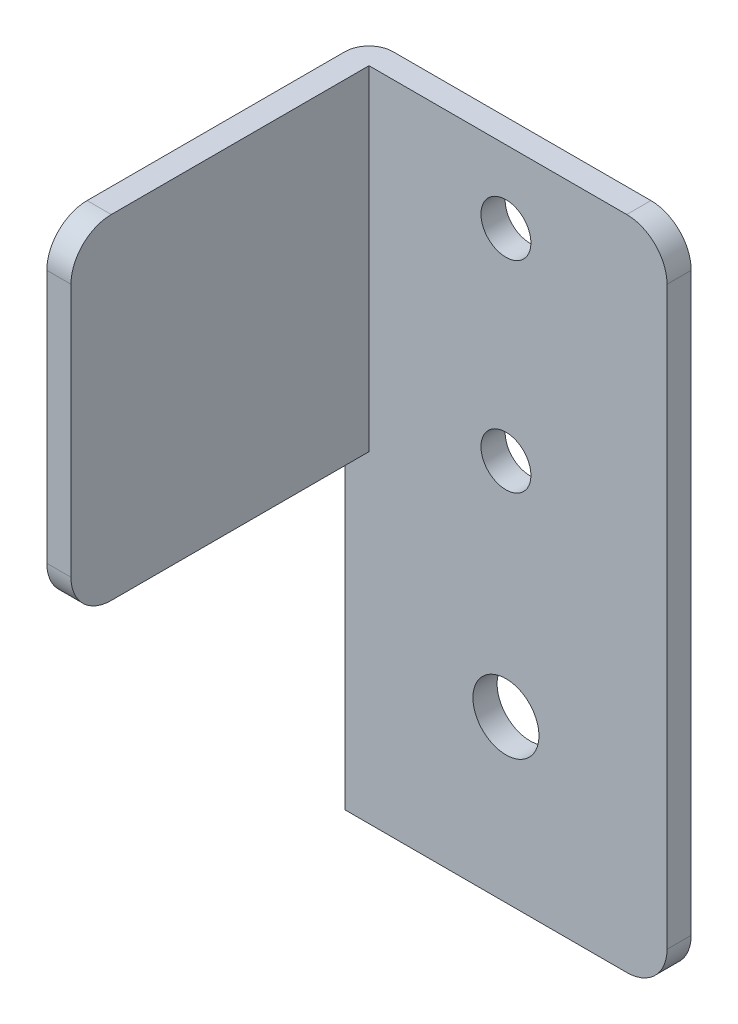
ISO-10303-21;
HEADER;
FILE_DESCRIPTION(('STEP AP214'),'2;1');
FILE_NAME('part.step','',(''),(''),'','','');
FILE_SCHEMA(('AUTOMOTIVE_DESIGN { 1 0 10303 214 1 1 1 1 }'));
ENDSEC;
DATA;
#1=APPLICATION_CONTEXT('core data for automotive mechanical design processes');
#2=APPLICATION_PROTOCOL_DEFINITION('international standard','automotive_design',2000,#1);
#3=PRODUCT_CONTEXT('',#1,'mechanical');
#4=PRODUCT('Part','Part','',(#3));
#5=PRODUCT_RELATED_PRODUCT_CATEGORY('part','',(#4));
#6=PRODUCT_DEFINITION_FORMATION('','',#4);
#7=PRODUCT_DEFINITION_CONTEXT('part definition',#1,'design');
#8=PRODUCT_DEFINITION('design','',#6,#7);
#9=PRODUCT_DEFINITION_SHAPE('','',#8);
#10=(LENGTH_UNIT() NAMED_UNIT(*) SI_UNIT(.MILLI.,.METRE.));
#11=(NAMED_UNIT(*) PLANE_ANGLE_UNIT() SI_UNIT($,.RADIAN.));
#12=(NAMED_UNIT(*) SI_UNIT($,.STERADIAN.) SOLID_ANGLE_UNIT());
#13=UNCERTAINTY_MEASURE_WITH_UNIT(LENGTH_MEASURE(1.E-05),#10,'distance_accuracy_value','');
#14=(GEOMETRIC_REPRESENTATION_CONTEXT(3) GLOBAL_UNCERTAINTY_ASSIGNED_CONTEXT((#13)) GLOBAL_UNIT_ASSIGNED_CONTEXT((#10,
#11,#12)) REPRESENTATION_CONTEXT('',''));
#15=CARTESIAN_POINT('',(0.,0.,0.));
#16=DIRECTION('',(0.,0.,1.));
#17=DIRECTION('',(1.,0.,0.));
#18=AXIS2_PLACEMENT_3D('',#15,#16,#17);
#19=CARTESIAN_POINT('',(3.00000000000002,81.5,3.));
#20=DIRECTION('',(0.,0.,-1.));
#21=DIRECTION('',(-1.,0.,0.));
#22=AXIS2_PLACEMENT_3D('',#19,#20,#21);
#23=PLANE('',#22);
#24=CARTESIAN_POINT('',(20.,72.5,3.));
#25=DIRECTION('',(0.,0.,-1.));
#26=DIRECTION('',(-1.,0.,0.));
#27=AXIS2_PLACEMENT_3D('',#24,#25,#26);
#28=CIRCLE('',#27,3.1);
#29=CARTESIAN_POINT('',(16.9,72.5,3.));
#30=VERTEX_POINT('',#29);
#31=EDGE_CURVE('E233',#30,#30,#28,.T.);
#32=ORIENTED_EDGE('',*,*,#31,.T.);
#33=EDGE_LOOP('',(#32));
#34=FACE_BOUND('',#33,.T.);
#35=CARTESIAN_POINT('',(20.,47.5,3.));
#36=DIRECTION('',(0.,0.,-1.));
#37=DIRECTION('',(-1.,0.,0.));
#38=AXIS2_PLACEMENT_3D('',#35,#36,#37);
#39=CIRCLE('',#38,3.1);
#40=CARTESIAN_POINT('',(16.9,47.5,3.));
#41=VERTEX_POINT('',#40);
#42=EDGE_CURVE('E227',#41,#41,#39,.T.);
#43=ORIENTED_EDGE('',*,*,#42,.T.);
#44=EDGE_LOOP('',(#43));
#45=FACE_BOUND('',#44,.T.);
#46=CARTESIAN_POINT('',(20.,20.,3.));
#47=DIRECTION('',(0.,0.,-1.));
#48=DIRECTION('',(-1.,0.,0.));
#49=AXIS2_PLACEMENT_3D('',#46,#47,#48);
#50=CIRCLE('',#49,4.1);
#51=CARTESIAN_POINT('',(15.9,20.,3.));
#52=VERTEX_POINT('',#51);
#53=EDGE_CURVE('E139',#52,#52,#50,.T.);
#54=ORIENTED_EDGE('',*,*,#53,.T.);
#55=EDGE_LOOP('',(#54));
#56=FACE_BOUND('',#55,.T.);
#57=DIRECTION('',(1.,0.,0.));
#58=VECTOR('',#57,1.);
#59=CARTESIAN_POINT('',(3.00000000000002,0.,3.));
#60=LINE('',#59,#58);
#61=CARTESIAN_POINT('',(0.,0.,3.00000000000002));
#62=VERTEX_POINT('',#61);
#63=CARTESIAN_POINT('',(35.,0.,3.));
#64=VERTEX_POINT('',#63);
#65=EDGE_CURVE('E199',#62,#64,#60,.T.);
#66=ORIENTED_EDGE('',*,*,#65,.T.);
#67=CARTESIAN_POINT('',(35.,5.,3.));
#68=DIRECTION('',(0.,0.,-1.));
#69=DIRECTION('',(-1.,0.,0.));
#70=AXIS2_PLACEMENT_3D('',#67,#68,#69);
#71=CIRCLE('',#70,5.);
#72=CARTESIAN_POINT('',(40.,5.,3.));
#73=VERTEX_POINT('',#72);
#74=EDGE_CURVE('E190',#64,#73,#71,.F.);
#75=ORIENTED_EDGE('',*,*,#74,.T.);
#76=DIRECTION('',(0.,-1.,0.));
#77=VECTOR('',#76,1.);
#78=CARTESIAN_POINT('',(40.,81.5,3.));
#79=LINE('',#78,#77);
#80=CARTESIAN_POINT('',(40.,76.5,3.));
#81=VERTEX_POINT('',#80);
#82=EDGE_CURVE('E164',#81,#73,#79,.T.);
#83=ORIENTED_EDGE('',*,*,#82,.F.);
#84=CARTESIAN_POINT('',(35.,76.5,3.));
#85=DIRECTION('',(0.,0.,-1.));
#86=DIRECTION('',(-1.,0.,0.));
#87=AXIS2_PLACEMENT_3D('',#84,#85,#86);
#88=CIRCLE('',#87,5.);
#89=CARTESIAN_POINT('',(35.,81.5,3.));
#90=VERTEX_POINT('',#89);
#91=EDGE_CURVE('E188',#81,#90,#88,.F.);
#92=ORIENTED_EDGE('',*,*,#91,.T.);
#93=DIRECTION('',(1.,0.,0.));
#94=VECTOR('',#93,1.);
#95=CARTESIAN_POINT('',(3.00000000000002,81.5,3.));
#96=LINE('',#95,#94);
#97=CARTESIAN_POINT('',(3.,81.5,3.));
#98=VERTEX_POINT('',#97);
#99=EDGE_CURVE('E143',#98,#90,#96,.T.);
#100=ORIENTED_EDGE('',*,*,#99,.F.);
#101=DIRECTION('',(0.,-1.,0.));
#102=VECTOR('',#101,1.);
#103=CARTESIAN_POINT('',(3.,81.5,3.));
#104=LINE('',#103,#102);
#105=CARTESIAN_POINT('',(3.,40.,3.));
#106=VERTEX_POINT('',#105);
#107=EDGE_CURVE('E135',#98,#106,#104,.T.);
#108=ORIENTED_EDGE('',*,*,#107,.T.);
#109=DIRECTION('',(1.,0.,0.));
#110=VECTOR('',#109,1.);
#111=CARTESIAN_POINT('',(-7.,40.,3.00000000000001));
#112=LINE('',#111,#110);
#113=CARTESIAN_POINT('',(0.,40.,3.));
#114=VERTEX_POINT('',#113);
#115=EDGE_CURVE('E118',#114,#106,#112,.T.);
#116=ORIENTED_EDGE('',*,*,#115,.F.);
#117=DIRECTION('',(0.,-1.,0.));
#118=VECTOR('',#117,1.);
#119=CARTESIAN_POINT('',(0.,81.5,3.));
#120=LINE('',#119,#118);
#121=EDGE_CURVE('E129',#114,#62,#120,.T.);
#122=ORIENTED_EDGE('',*,*,#121,.T.);
#123=EDGE_LOOP('',(#66,#75,#83,#92,#100,#108,#116,#122));
#124=FACE_BOUND('',#123,.T.);
#125=ADVANCED_FACE('F32',(#34,#45,#56,#124),#23,.F.);
#126=CARTESIAN_POINT('',(40.,81.5,0.));
#127=DIRECTION('',(1.,0.,0.));
#128=DIRECTION('',(0.,0.,-1.));
#129=AXIS2_PLACEMENT_3D('',#126,#127,#128);
#130=PLANE('',#129);
#131=ORIENTED_EDGE('',*,*,#82,.T.);
#132=DIRECTION('',(0.,0.,1.));
#133=VECTOR('',#132,1.);
#134=CARTESIAN_POINT('',(40.,5.,0.));
#135=LINE('',#134,#133);
#136=CARTESIAN_POINT('',(40.,5.,0.));
#137=VERTEX_POINT('',#136);
#138=EDGE_CURVE('E47',#73,#137,#135,.F.);
#139=ORIENTED_EDGE('',*,*,#138,.T.);
#140=DIRECTION('',(0.,-1.,0.));
#141=VECTOR('',#140,1.);
#142=CARTESIAN_POINT('',(40.,81.5,0.));
#143=LINE('',#142,#141);
#144=CARTESIAN_POINT('',(40.,76.5,0.));
#145=VERTEX_POINT('',#144);
#146=EDGE_CURVE('E162',#145,#137,#143,.T.);
#147=ORIENTED_EDGE('',*,*,#146,.F.);
#148=DIRECTION('',(0.,0.,1.));
#149=VECTOR('',#148,1.);
#150=CARTESIAN_POINT('',(40.,76.5,3.));
#151=LINE('',#150,#149);
#152=EDGE_CURVE('E192',#145,#81,#151,.T.);
#153=ORIENTED_EDGE('',*,*,#152,.T.);
#154=EDGE_LOOP('',(#131,#139,#147,#153));
#155=FACE_BOUND('',#154,.T.);
#156=ADVANCED_FACE('F197',(#155),#130,.T.);
#157=CARTESIAN_POINT('',(3.00000000000002,81.5,0.));
#158=DIRECTION('',(0.,0.,-1.));
#159=DIRECTION('',(-1.,0.,0.));
#160=AXIS2_PLACEMENT_3D('',#157,#158,#159);
#161=PLANE('',#160);
#162=CARTESIAN_POINT('',(20.,72.5,0.));
#163=DIRECTION('',(0.,0.,-1.));
#164=DIRECTION('',(-1.,0.,0.));
#165=AXIS2_PLACEMENT_3D('',#162,#163,#164);
#166=CIRCLE('',#165,3.1);
#167=CARTESIAN_POINT('',(16.9,72.5,0.));
#168=VERTEX_POINT('',#167);
#169=EDGE_CURVE('E236',#168,#168,#166,.T.);
#170=ORIENTED_EDGE('',*,*,#169,.F.);
#171=EDGE_LOOP('',(#170));
#172=FACE_BOUND('',#171,.T.);
#173=CARTESIAN_POINT('',(20.,47.5,0.));
#174=DIRECTION('',(0.,0.,-1.));
#175=DIRECTION('',(-1.,0.,0.));
#176=AXIS2_PLACEMENT_3D('',#173,#174,#175);
#177=CIRCLE('',#176,3.1);
#178=CARTESIAN_POINT('',(16.9,47.5,0.));
#179=VERTEX_POINT('',#178);
#180=EDGE_CURVE('E230',#179,#179,#177,.T.);
#181=ORIENTED_EDGE('',*,*,#180,.F.);
#182=EDGE_LOOP('',(#181));
#183=FACE_BOUND('',#182,.T.);
#184=CARTESIAN_POINT('',(20.,20.,0.));
#185=DIRECTION('',(0.,0.,-1.));
#186=DIRECTION('',(-1.,0.,0.));
#187=AXIS2_PLACEMENT_3D('',#184,#185,#186);
#188=CIRCLE('',#187,4.1);
#189=CARTESIAN_POINT('',(15.9,20.,0.));
#190=VERTEX_POINT('',#189);
#191=EDGE_CURVE('E224',#190,#190,#188,.T.);
#192=ORIENTED_EDGE('',*,*,#191,.F.);
#193=EDGE_LOOP('',(#192));
#194=FACE_BOUND('',#193,.T.);
#195=ORIENTED_EDGE('',*,*,#146,.T.);
#196=CARTESIAN_POINT('',(35.,5.,0.));
#197=DIRECTION('',(0.,0.,-1.));
#198=DIRECTION('',(-1.,0.,0.));
#199=AXIS2_PLACEMENT_3D('',#196,#197,#198);
#200=CIRCLE('',#199,5.);
#201=CARTESIAN_POINT('',(35.,0.,0.));
#202=VERTEX_POINT('',#201);
#203=EDGE_CURVE('E11',#137,#202,#200,.T.);
#204=ORIENTED_EDGE('',*,*,#203,.T.);
#205=DIRECTION('',(1.,0.,0.));
#206=VECTOR('',#205,1.);
#207=CARTESIAN_POINT('',(3.00000000000002,0.,0.));
#208=LINE('',#207,#206);
#209=CARTESIAN_POINT('',(3.,0.,0.));
#210=VERTEX_POINT('',#209);
#211=EDGE_CURVE('E209',#210,#202,#208,.T.);
#212=ORIENTED_EDGE('',*,*,#211,.F.);
#213=DIRECTION('',(0.,-1.,0.));
#214=VECTOR('',#213,1.);
#215=CARTESIAN_POINT('',(3.,81.5,0.));
#216=LINE('',#215,#214);
#217=CARTESIAN_POINT('',(3.,81.5,0.));
#218=VERTEX_POINT('',#217);
#219=EDGE_CURVE('E160',#218,#210,#216,.T.);
#220=ORIENTED_EDGE('',*,*,#219,.F.);
#221=DIRECTION('',(1.,0.,0.));
#222=VECTOR('',#221,1.);
#223=CARTESIAN_POINT('',(3.00000000000002,81.5,0.));
#224=LINE('',#223,#222);
#225=CARTESIAN_POINT('',(35.,81.5,0.));
#226=VERTEX_POINT('',#225);
#227=EDGE_CURVE('E217',#218,#226,#224,.T.);
#228=ORIENTED_EDGE('',*,*,#227,.T.);
#229=CARTESIAN_POINT('',(35.,76.5,0.));
#230=DIRECTION('',(0.,0.,-1.));
#231=DIRECTION('',(-1.,0.,0.));
#232=AXIS2_PLACEMENT_3D('',#229,#230,#231);
#233=CIRCLE('',#232,5.);
#234=EDGE_CURVE('E40',#226,#145,#233,.T.);
#235=ORIENTED_EDGE('',*,*,#234,.T.);
#236=EDGE_LOOP('',(#195,#204,#212,#220,#228,#235));
#237=FACE_BOUND('',#236,.T.);
#238=ADVANCED_FACE('F243',(#172,#183,#194,#237),#161,.T.);
#239=CARTESIAN_POINT('',(3.,81.5,3.));
#240=DIRECTION('',(0.,-1.,0.));
#241=DIRECTION('',(0.,0.,-1.));
#242=AXIS2_PLACEMENT_3D('',#239,#240,#241);
#243=CYLINDRICAL_SURFACE('',#242,3.);
#244=CARTESIAN_POINT('',(3.,0.,3.));
#245=DIRECTION('',(0.,-1.,0.));
#246=DIRECTION('',(0.,0.,-1.));
#247=AXIS2_PLACEMENT_3D('',#244,#245,#246);
#248=CIRCLE('',#247,3.);
#249=EDGE_CURVE('E152',#62,#210,#248,.T.);
#250=ORIENTED_EDGE('',*,*,#249,.F.);
#251=ORIENTED_EDGE('',*,*,#121,.F.);
#252=DIRECTION('',(0.,-1.,0.));
#253=VECTOR('',#252,1.);
#254=CARTESIAN_POINT('',(0.,81.5,3.00000000000002));
#255=LINE('',#254,#253);
#256=CARTESIAN_POINT('',(0.,81.5,3.00000000000002));
#257=VERTEX_POINT('',#256);
#258=EDGE_CURVE('E157',#257,#114,#255,.T.);
#259=ORIENTED_EDGE('',*,*,#258,.F.);
#260=CARTESIAN_POINT('',(3.,81.5,3.));
#261=DIRECTION('',(0.,-1.,0.));
#262=DIRECTION('',(0.,0.,-1.));
#263=AXIS2_PLACEMENT_3D('',#260,#261,#262);
#264=CIRCLE('',#263,3.);
#265=EDGE_CURVE('E214',#257,#218,#264,.T.);
#266=ORIENTED_EDGE('',*,*,#265,.T.);
#267=ORIENTED_EDGE('',*,*,#219,.T.);
#268=EDGE_LOOP('',(#250,#251,#259,#266,#267));
#269=FACE_BOUND('',#268,.T.);
#270=ADVANCED_FACE('F246',(#269),#243,.T.);
#271=CARTESIAN_POINT('',(0.,81.5,3.00000000000002));
#272=DIRECTION('',(-1.,0.,0.));
#273=DIRECTION('',(0.,0.,1.));
#274=AXIS2_PLACEMENT_3D('',#271,#272,#273);
#275=PLANE('',#274);
#276=DIRECTION('',(0.,-1.,0.));
#277=VECTOR('',#276,1.);
#278=CARTESIAN_POINT('',(0.,81.5,40.));
#279=LINE('',#278,#277);
#280=CARTESIAN_POINT('',(0.,76.5,40.));
#281=VERTEX_POINT('',#280);
#282=CARTESIAN_POINT('',(0.,45.,40.));
#283=VERTEX_POINT('',#282);
#284=EDGE_CURVE('E147',#281,#283,#279,.T.);
#285=ORIENTED_EDGE('',*,*,#284,.F.);
#286=CARTESIAN_POINT('',(0.,76.5,35.));
#287=DIRECTION('',(-1.,0.,0.));
#288=DIRECTION('',(0.,0.,1.));
#289=AXIS2_PLACEMENT_3D('',#286,#287,#288);
#290=CIRCLE('',#289,5.);
#291=CARTESIAN_POINT('',(0.,81.5,35.));
#292=VERTEX_POINT('',#291);
#293=EDGE_CURVE('E174',#281,#292,#290,.T.);
#294=ORIENTED_EDGE('',*,*,#293,.T.);
#295=DIRECTION('',(0.,0.,-1.));
#296=VECTOR('',#295,1.);
#297=CARTESIAN_POINT('',(0.,81.5,3.00000000000002));
#298=LINE('',#297,#296);
#299=EDGE_CURVE('E149',#292,#257,#298,.T.);
#300=ORIENTED_EDGE('',*,*,#299,.T.);
#301=ORIENTED_EDGE('',*,*,#258,.T.);
#302=DIRECTION('',(0.,0.,-1.));
#303=VECTOR('',#302,1.);
#304=CARTESIAN_POINT('',(0.,40.,3.00000000000001));
#305=LINE('',#304,#303);
#306=CARTESIAN_POINT('',(0.,40.,35.));
#307=VERTEX_POINT('',#306);
#308=EDGE_CURVE('E124',#307,#114,#305,.T.);
#309=ORIENTED_EDGE('',*,*,#308,.F.);
#310=CARTESIAN_POINT('',(0.,45.,35.));
#311=DIRECTION('',(-1.,0.,0.));
#312=DIRECTION('',(0.,0.,1.));
#313=AXIS2_PLACEMENT_3D('',#310,#311,#312);
#314=CIRCLE('',#313,5.);
#315=EDGE_CURVE('E172',#307,#283,#314,.T.);
#316=ORIENTED_EDGE('',*,*,#315,.T.);
#317=EDGE_LOOP('',(#285,#294,#300,#301,#309,#316));
#318=FACE_BOUND('',#317,.T.);
#319=ADVANCED_FACE('F299',(#318),#275,.T.);
#320=CARTESIAN_POINT('',(3.,81.5,40.));
#321=DIRECTION('',(0.,0.,1.));
#322=DIRECTION('',(1.,0.,0.));
#323=AXIS2_PLACEMENT_3D('',#320,#321,#322);
#324=PLANE('',#323);
#325=DIRECTION('',(0.,-1.,0.));
#326=VECTOR('',#325,1.);
#327=CARTESIAN_POINT('',(3.,81.5,40.));
#328=LINE('',#327,#326);
#329=CARTESIAN_POINT('',(3.,76.5,40.));
#330=VERTEX_POINT('',#329);
#331=CARTESIAN_POINT('',(3.,45.,40.));
#332=VERTEX_POINT('',#331);
#333=EDGE_CURVE('E144',#330,#332,#328,.T.);
#334=ORIENTED_EDGE('',*,*,#333,.F.);
#335=DIRECTION('',(-1.,0.,0.));
#336=VECTOR('',#335,1.);
#337=CARTESIAN_POINT('',(0.,76.5,40.));
#338=LINE('',#337,#336);
#339=EDGE_CURVE('E169',#330,#281,#338,.T.);
#340=ORIENTED_EDGE('',*,*,#339,.T.);
#341=ORIENTED_EDGE('',*,*,#284,.T.);
#342=DIRECTION('',(1.,0.,0.));
#343=VECTOR('',#342,1.);
#344=CARTESIAN_POINT('',(3.,45.,40.));
#345=LINE('',#344,#343);
#346=EDGE_CURVE('E166',#283,#332,#345,.T.);
#347=ORIENTED_EDGE('',*,*,#346,.T.);
#348=EDGE_LOOP('',(#334,#340,#341,#347));
#349=FACE_BOUND('',#348,.T.);
#350=ADVANCED_FACE('F295',(#349),#324,.T.);
#351=CARTESIAN_POINT('',(3.,81.5,3.00000000000002));
#352=DIRECTION('',(-1.,0.,0.));
#353=DIRECTION('',(0.,0.,1.));
#354=AXIS2_PLACEMENT_3D('',#351,#352,#353);
#355=PLANE('',#354);
#356=DIRECTION('',(0.,0.,-1.));
#357=VECTOR('',#356,1.);
#358=CARTESIAN_POINT('',(3.,81.5,3.00000000000002));
#359=LINE('',#358,#357);
#360=CARTESIAN_POINT('',(3.,81.5,35.));
#361=VERTEX_POINT('',#360);
#362=EDGE_CURVE('E145',#361,#98,#359,.T.);
#363=ORIENTED_EDGE('',*,*,#362,.F.);
#364=CARTESIAN_POINT('',(3.,76.5,35.));
#365=DIRECTION('',(-1.,0.,0.));
#366=DIRECTION('',(0.,0.,1.));
#367=AXIS2_PLACEMENT_3D('',#364,#365,#366);
#368=CIRCLE('',#367,5.);
#369=EDGE_CURVE('E181',#361,#330,#368,.F.);
#370=ORIENTED_EDGE('',*,*,#369,.T.);
#371=ORIENTED_EDGE('',*,*,#333,.T.);
#372=CARTESIAN_POINT('',(3.,45.,35.));
#373=DIRECTION('',(-1.,0.,0.));
#374=DIRECTION('',(0.,0.,1.));
#375=AXIS2_PLACEMENT_3D('',#372,#373,#374);
#376=CIRCLE('',#375,5.);
#377=CARTESIAN_POINT('',(3.,40.,35.));
#378=VERTEX_POINT('',#377);
#379=EDGE_CURVE('E138',#332,#378,#376,.F.);
#380=ORIENTED_EDGE('',*,*,#379,.T.);
#381=DIRECTION('',(0.,0.,1.));
#382=VECTOR('',#381,1.);
#383=CARTESIAN_POINT('',(3.,40.,3.));
#384=LINE('',#383,#382);
#385=EDGE_CURVE('E121',#106,#378,#384,.T.);
#386=ORIENTED_EDGE('',*,*,#385,.F.);
#387=ORIENTED_EDGE('',*,*,#107,.F.);
#388=EDGE_LOOP('',(#363,#370,#371,#380,#386,#387));
#389=FACE_BOUND('',#388,.T.);
#390=ADVANCED_FACE('F134',(#389),#355,.F.);
#391=CARTESIAN_POINT('',(3.,81.5,3.));
#392=DIRECTION('',(0.,-1.,0.));
#393=DIRECTION('',(-1.,0.,0.));
#394=AXIS2_PLACEMENT_3D('',#391,#392,#393);
#395=PLANE('',#394);
#396=ORIENTED_EDGE('',*,*,#299,.F.);
#397=DIRECTION('',(-1.,0.,0.));
#398=VECTOR('',#397,1.);
#399=CARTESIAN_POINT('',(3.,81.5,35.));
#400=LINE('',#399,#398);
#401=EDGE_CURVE('E178',#292,#361,#400,.F.);
#402=ORIENTED_EDGE('',*,*,#401,.T.);
#403=ORIENTED_EDGE('',*,*,#362,.T.);
#404=ORIENTED_EDGE('',*,*,#99,.T.);
#405=DIRECTION('',(0.,0.,1.));
#406=VECTOR('',#405,1.);
#407=CARTESIAN_POINT('',(35.,81.5,0.));
#408=LINE('',#407,#406);
#409=EDGE_CURVE('E176',#90,#226,#408,.F.);
#410=ORIENTED_EDGE('',*,*,#409,.T.);
#411=ORIENTED_EDGE('',*,*,#227,.F.);
#412=ORIENTED_EDGE('',*,*,#265,.F.);
#413=EDGE_LOOP('',(#396,#402,#403,#404,#410,#411,#412));
#414=FACE_BOUND('',#413,.T.);
#415=ADVANCED_FACE('F285',(#414),#395,.F.);
#416=CARTESIAN_POINT('',(3.,0.,3.));
#417=DIRECTION('',(0.,-1.,0.));
#418=DIRECTION('',(-1.,0.,0.));
#419=AXIS2_PLACEMENT_3D('',#416,#417,#418);
#420=PLANE('',#419);
#421=ORIENTED_EDGE('',*,*,#211,.T.);
#422=DIRECTION('',(0.,0.,1.));
#423=VECTOR('',#422,1.);
#424=CARTESIAN_POINT('',(35.,0.,3.));
#425=LINE('',#424,#423);
#426=EDGE_CURVE('E185',#202,#64,#425,.T.);
#427=ORIENTED_EDGE('',*,*,#426,.T.);
#428=ORIENTED_EDGE('',*,*,#65,.F.);
#429=ORIENTED_EDGE('',*,*,#249,.T.);
#430=EDGE_LOOP('',(#421,#427,#428,#429));
#431=FACE_BOUND('',#430,.T.);
#432=ADVANCED_FACE('F206',(#431),#420,.T.);
#433=CARTESIAN_POINT('',(-7.,40.,3.00000000000001));
#434=DIRECTION('',(0.,1.,0.));
#435=DIRECTION('',(0.,0.,1.));
#436=AXIS2_PLACEMENT_3D('',#433,#434,#435);
#437=PLANE('',#436);
#438=ORIENTED_EDGE('',*,*,#385,.T.);
#439=DIRECTION('',(1.,0.,0.));
#440=VECTOR('',#439,1.);
#441=CARTESIAN_POINT('',(0.,40.,35.));
#442=LINE('',#441,#440);
#443=EDGE_CURVE('E183',#378,#307,#442,.F.);
#444=ORIENTED_EDGE('',*,*,#443,.T.);
#445=ORIENTED_EDGE('',*,*,#308,.T.);
#446=ORIENTED_EDGE('',*,*,#115,.T.);
#447=EDGE_LOOP('',(#438,#444,#445,#446));
#448=FACE_BOUND('',#447,.T.);
#449=ADVANCED_FACE('F120',(#448),#437,.F.);
#450=CARTESIAN_POINT('',(20.,20.,10.));
#451=DIRECTION('',(0.,0.,-1.));
#452=DIRECTION('',(-1.,0.,0.));
#453=AXIS2_PLACEMENT_3D('',#450,#451,#452);
#454=CYLINDRICAL_SURFACE('',#453,4.1);
#455=ORIENTED_EDGE('',*,*,#191,.T.);
#456=EDGE_LOOP('',(#455));
#457=FACE_BOUND('',#456,.T.);
#458=ORIENTED_EDGE('',*,*,#53,.F.);
#459=EDGE_LOOP('',(#458));
#460=FACE_BOUND('',#459,.T.);
#461=ADVANCED_FACE('F252',(#457,#460),#454,.F.);
#462=CARTESIAN_POINT('',(20.,47.5,10.));
#463=DIRECTION('',(0.,0.,-1.));
#464=DIRECTION('',(-1.,0.,0.));
#465=AXIS2_PLACEMENT_3D('',#462,#463,#464);
#466=CYLINDRICAL_SURFACE('',#465,3.1);
#467=ORIENTED_EDGE('',*,*,#180,.T.);
#468=EDGE_LOOP('',(#467));
#469=FACE_BOUND('',#468,.T.);
#470=ORIENTED_EDGE('',*,*,#42,.F.);
#471=EDGE_LOOP('',(#470));
#472=FACE_BOUND('',#471,.T.);
#473=ADVANCED_FACE('F255',(#469,#472),#466,.F.);
#474=CARTESIAN_POINT('',(20.,72.5,10.));
#475=DIRECTION('',(0.,0.,-1.));
#476=DIRECTION('',(-1.,0.,0.));
#477=AXIS2_PLACEMENT_3D('',#474,#475,#476);
#478=CYLINDRICAL_SURFACE('',#477,3.1);
#479=ORIENTED_EDGE('',*,*,#169,.T.);
#480=EDGE_LOOP('',(#479));
#481=FACE_BOUND('',#480,.T.);
#482=ORIENTED_EDGE('',*,*,#31,.F.);
#483=EDGE_LOOP('',(#482));
#484=FACE_BOUND('',#483,.T.);
#485=ADVANCED_FACE('F240',(#481,#484),#478,.F.);
#486=CARTESIAN_POINT('',(3.,76.5,35.));
#487=DIRECTION('',(1.,0.,0.));
#488=DIRECTION('',(0.,0.,-1.));
#489=AXIS2_PLACEMENT_3D('',#486,#487,#488);
#490=CYLINDRICAL_SURFACE('',#489,5.);
#491=ORIENTED_EDGE('',*,*,#369,.F.);
#492=ORIENTED_EDGE('',*,*,#401,.F.);
#493=ORIENTED_EDGE('',*,*,#293,.F.);
#494=ORIENTED_EDGE('',*,*,#339,.F.);
#495=EDGE_LOOP('',(#491,#492,#493,#494));
#496=FACE_BOUND('',#495,.T.);
#497=ADVANCED_FACE('F268',(#496),#490,.T.);
#498=CARTESIAN_POINT('',(3.,45.,35.));
#499=DIRECTION('',(-1.,0.,0.));
#500=DIRECTION('',(0.,-1.,0.));
#501=AXIS2_PLACEMENT_3D('',#498,#499,#500);
#502=CYLINDRICAL_SURFACE('',#501,5.);
#503=ORIENTED_EDGE('',*,*,#315,.F.);
#504=ORIENTED_EDGE('',*,*,#443,.F.);
#505=ORIENTED_EDGE('',*,*,#379,.F.);
#506=ORIENTED_EDGE('',*,*,#346,.F.);
#507=EDGE_LOOP('',(#503,#504,#505,#506));
#508=FACE_BOUND('',#507,.T.);
#509=ADVANCED_FACE('F271',(#508),#502,.T.);
#510=CARTESIAN_POINT('',(35.,5.,3.));
#511=DIRECTION('',(0.,0.,1.));
#512=DIRECTION('',(1.,0.,0.));
#513=AXIS2_PLACEMENT_3D('',#510,#511,#512);
#514=CYLINDRICAL_SURFACE('',#513,5.);
#515=ORIENTED_EDGE('',*,*,#203,.F.);
#516=ORIENTED_EDGE('',*,*,#138,.F.);
#517=ORIENTED_EDGE('',*,*,#74,.F.);
#518=ORIENTED_EDGE('',*,*,#426,.F.);
#519=EDGE_LOOP('',(#515,#516,#517,#518));
#520=FACE_BOUND('',#519,.T.);
#521=ADVANCED_FACE('F203',(#520),#514,.T.);
#522=CARTESIAN_POINT('',(35.,76.5,0.));
#523=DIRECTION('',(0.,0.,-1.));
#524=DIRECTION('',(-1.,0.,0.));
#525=AXIS2_PLACEMENT_3D('',#522,#523,#524);
#526=CYLINDRICAL_SURFACE('',#525,5.);
#527=ORIENTED_EDGE('',*,*,#234,.F.);
#528=ORIENTED_EDGE('',*,*,#409,.F.);
#529=ORIENTED_EDGE('',*,*,#91,.F.);
#530=ORIENTED_EDGE('',*,*,#152,.F.);
#531=EDGE_LOOP('',(#527,#528,#529,#530));
#532=FACE_BOUND('',#531,.T.);
#533=ADVANCED_FACE('F34',(#532),#526,.T.);
#534=CLOSED_SHELL('',(#125,#156,#238,#270,#319,#350,#390,#415,#432,#449,#461,#473,#485,#497,
#509,#521,#533));
#535=MANIFOLD_SOLID_BREP('B2',#534);
#536=ADVANCED_BREP_SHAPE_REPRESENTATION('',(#18,#535),#14);
#537=SHAPE_DEFINITION_REPRESENTATION(#9,#536);
ENDSEC;
END-ISO-10303-21;
